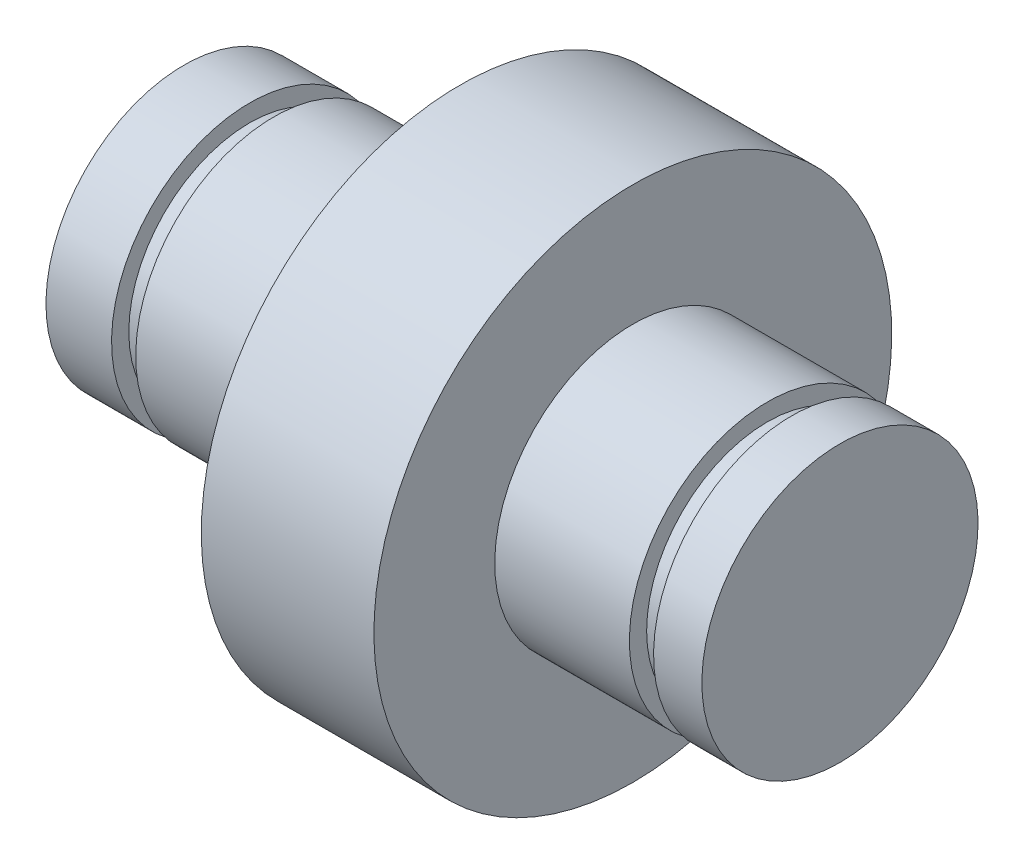
ISO-10303-21;
HEADER;
FILE_DESCRIPTION(('STEP AP214'),'2;1');
FILE_NAME('part.step','',(''),(''),'','','');
FILE_SCHEMA(('AUTOMOTIVE_DESIGN { 1 0 10303 214 1 1 1 1 }'));
ENDSEC;
DATA;
#1=APPLICATION_CONTEXT('core data for automotive mechanical design processes');
#2=APPLICATION_PROTOCOL_DEFINITION('international standard','automotive_design',2000,#1);
#3=PRODUCT_CONTEXT('',#1,'mechanical');
#4=PRODUCT('Part','Part','',(#3));
#5=PRODUCT_RELATED_PRODUCT_CATEGORY('part','',(#4));
#6=PRODUCT_DEFINITION_FORMATION('','',#4);
#7=PRODUCT_DEFINITION_CONTEXT('part definition',#1,'design');
#8=PRODUCT_DEFINITION('design','',#6,#7);
#9=PRODUCT_DEFINITION_SHAPE('','',#8);
#10=(LENGTH_UNIT() NAMED_UNIT(*) SI_UNIT(.MILLI.,.METRE.));
#11=(NAMED_UNIT(*) PLANE_ANGLE_UNIT() SI_UNIT($,.RADIAN.));
#12=(NAMED_UNIT(*) SI_UNIT($,.STERADIAN.) SOLID_ANGLE_UNIT());
#13=UNCERTAINTY_MEASURE_WITH_UNIT(LENGTH_MEASURE(1.E-05),#10,'distance_accuracy_value','');
#14=(GEOMETRIC_REPRESENTATION_CONTEXT(3) GLOBAL_UNCERTAINTY_ASSIGNED_CONTEXT((#13)) GLOBAL_UNIT_ASSIGNED_CONTEXT((#10,
#11,#12)) REPRESENTATION_CONTEXT('',''));
#15=CARTESIAN_POINT('',(0.,0.,0.));
#16=DIRECTION('',(0.,0.,1.));
#17=DIRECTION('',(1.,0.,0.));
#18=AXIS2_PLACEMENT_3D('',#15,#16,#17);
#19=CARTESIAN_POINT('',(-8.,0.,0.));
#20=DIRECTION('',(1.,0.,0.));
#21=DIRECTION('',(0.,1.,0.));
#22=AXIS2_PLACEMENT_3D('',#19,#20,#21);
#23=PLANE('',#22);
#24=CARTESIAN_POINT('',(-8.,0.,0.));
#25=DIRECTION('',(-1.,0.,0.));
#26=DIRECTION('',(0.,-1.,0.));
#27=AXIS2_PLACEMENT_3D('',#24,#25,#26);
#28=CIRCLE('',#27,4.);
#29=CARTESIAN_POINT('',(-8.,-4.,0.));
#30=VERTEX_POINT('',#29);
#31=EDGE_CURVE('E10',#30,#30,#28,.T.);
#32=ORIENTED_EDGE('',*,*,#31,.T.);
#33=EDGE_LOOP('',(#32));
#34=FACE_BOUND('',#33,.T.);
#35=ADVANCED_FACE('F37',(#34),#23,.F.);
#36=CARTESIAN_POINT('',(-10.8004648691461,0.,0.));
#37=DIRECTION('',(-1.,0.,0.));
#38=DIRECTION('',(0.,-1.,0.));
#39=AXIS2_PLACEMENT_3D('',#36,#37,#38);
#40=CYLINDRICAL_SURFACE('',#39,4.);
#41=ORIENTED_EDGE('',*,*,#31,.F.);
#42=EDGE_LOOP('',(#41));
#43=FACE_BOUND('',#42,.T.);
#44=CARTESIAN_POINT('',(-6.1,0.,0.));
#45=DIRECTION('',(-1.,0.,0.));
#46=DIRECTION('',(0.,-1.,0.));
#47=AXIS2_PLACEMENT_3D('',#44,#45,#46);
#48=CIRCLE('',#47,4.);
#49=CARTESIAN_POINT('',(-6.1,-4.,0.));
#50=VERTEX_POINT('',#49);
#51=EDGE_CURVE('E44',#50,#50,#48,.T.);
#52=ORIENTED_EDGE('',*,*,#51,.T.);
#53=EDGE_LOOP('',(#52));
#54=FACE_BOUND('',#53,.T.);
#55=ADVANCED_FACE('F113',(#43,#54),#40,.T.);
#56=CARTESIAN_POINT('',(-6.1,4.,0.));
#57=DIRECTION('',(-1.,0.,0.));
#58=DIRECTION('',(0.,-1.,0.));
#59=AXIS2_PLACEMENT_3D('',#56,#57,#58);
#60=PLANE('',#59);
#61=ORIENTED_EDGE('',*,*,#51,.F.);
#62=EDGE_LOOP('',(#61));
#63=FACE_BOUND('',#62,.T.);
#64=CARTESIAN_POINT('',(-6.1,0.,0.));
#65=DIRECTION('',(-1.,0.,0.));
#66=DIRECTION('',(0.,-1.,0.));
#67=AXIS2_PLACEMENT_3D('',#64,#65,#66);
#68=CIRCLE('',#67,3.5);
#69=CARTESIAN_POINT('',(-6.1,-3.5,0.));
#70=VERTEX_POINT('',#69);
#71=EDGE_CURVE('E49',#70,#70,#68,.T.);
#72=ORIENTED_EDGE('',*,*,#71,.T.);
#73=EDGE_LOOP('',(#72));
#74=FACE_BOUND('',#73,.T.);
#75=ADVANCED_FACE('F117',(#63,#74),#60,.F.);
#76=CARTESIAN_POINT('',(-10.8004648691461,0.,0.));
#77=DIRECTION('',(-1.,0.,0.));
#78=DIRECTION('',(0.,-1.,0.));
#79=AXIS2_PLACEMENT_3D('',#76,#77,#78);
#80=CYLINDRICAL_SURFACE('',#79,3.5);
#81=ORIENTED_EDGE('',*,*,#71,.F.);
#82=EDGE_LOOP('',(#81));
#83=FACE_BOUND('',#82,.T.);
#84=CARTESIAN_POINT('',(-5.4,0.,0.));
#85=DIRECTION('',(-1.,0.,0.));
#86=DIRECTION('',(0.,-1.,0.));
#87=AXIS2_PLACEMENT_3D('',#84,#85,#86);
#88=CIRCLE('',#87,3.5);
#89=CARTESIAN_POINT('',(-5.4,-3.5,0.));
#90=VERTEX_POINT('',#89);
#91=EDGE_CURVE('E54',#90,#90,#88,.T.);
#92=ORIENTED_EDGE('',*,*,#91,.T.);
#93=EDGE_LOOP('',(#92));
#94=FACE_BOUND('',#93,.T.);
#95=ADVANCED_FACE('F122',(#83,#94),#80,.T.);
#96=CARTESIAN_POINT('',(-5.4,3.5,0.));
#97=DIRECTION('',(1.,0.,0.));
#98=DIRECTION('',(0.,1.,0.));
#99=AXIS2_PLACEMENT_3D('',#96,#97,#98);
#100=PLANE('',#99);
#101=ORIENTED_EDGE('',*,*,#91,.F.);
#102=EDGE_LOOP('',(#101));
#103=FACE_BOUND('',#102,.T.);
#104=CARTESIAN_POINT('',(-5.4,0.,0.));
#105=DIRECTION('',(-1.,0.,0.));
#106=DIRECTION('',(0.,-1.,0.));
#107=AXIS2_PLACEMENT_3D('',#104,#105,#106);
#108=CIRCLE('',#107,4.);
#109=CARTESIAN_POINT('',(-5.4,-4.,0.));
#110=VERTEX_POINT('',#109);
#111=EDGE_CURVE('E60',#110,#110,#108,.T.);
#112=ORIENTED_EDGE('',*,*,#111,.T.);
#113=EDGE_LOOP('',(#112));
#114=FACE_BOUND('',#113,.T.);
#115=ADVANCED_FACE('F128',(#103,#114),#100,.F.);
#116=CARTESIAN_POINT('',(-10.8004648691461,0.,0.));
#117=DIRECTION('',(-1.,0.,0.));
#118=DIRECTION('',(0.,-1.,0.));
#119=AXIS2_PLACEMENT_3D('',#116,#117,#118);
#120=CYLINDRICAL_SURFACE('',#119,4.);
#121=ORIENTED_EDGE('',*,*,#111,.F.);
#122=EDGE_LOOP('',(#121));
#123=FACE_BOUND('',#122,.T.);
#124=CARTESIAN_POINT('',(0.,0.,0.));
#125=DIRECTION('',(-1.,0.,0.));
#126=DIRECTION('',(0.,-1.,0.));
#127=AXIS2_PLACEMENT_3D('',#124,#125,#126);
#128=CIRCLE('',#127,4.);
#129=CARTESIAN_POINT('',(0.,-4.,0.));
#130=VERTEX_POINT('',#129);
#131=EDGE_CURVE('E64',#130,#130,#128,.T.);
#132=ORIENTED_EDGE('',*,*,#131,.T.);
#133=EDGE_LOOP('',(#132));
#134=FACE_BOUND('',#133,.T.);
#135=ADVANCED_FACE('F132',(#123,#134),#120,.T.);
#136=CARTESIAN_POINT('',(0.,4.,0.));
#137=DIRECTION('',(1.,0.,0.));
#138=DIRECTION('',(0.,1.,0.));
#139=AXIS2_PLACEMENT_3D('',#136,#137,#138);
#140=PLANE('',#139);
#141=ORIENTED_EDGE('',*,*,#131,.F.);
#142=EDGE_LOOP('',(#141));
#143=FACE_BOUND('',#142,.T.);
#144=CARTESIAN_POINT('',(0.,0.,0.));
#145=DIRECTION('',(-1.,0.,0.));
#146=DIRECTION('',(0.,-1.,0.));
#147=AXIS2_PLACEMENT_3D('',#144,#145,#146);
#148=CIRCLE('',#147,7.5);
#149=CARTESIAN_POINT('',(0.,-7.5,0.));
#150=VERTEX_POINT('',#149);
#151=EDGE_CURVE('E68',#150,#150,#148,.T.);
#152=ORIENTED_EDGE('',*,*,#151,.T.);
#153=EDGE_LOOP('',(#152));
#154=FACE_BOUND('',#153,.T.);
#155=ADVANCED_FACE('F136',(#143,#154),#140,.F.);
#156=CARTESIAN_POINT('',(-10.8004648691461,0.,0.));
#157=DIRECTION('',(-1.,0.,0.));
#158=DIRECTION('',(0.,-1.,0.));
#159=AXIS2_PLACEMENT_3D('',#156,#157,#158);
#160=CYLINDRICAL_SURFACE('',#159,7.5);
#161=ORIENTED_EDGE('',*,*,#151,.F.);
#162=EDGE_LOOP('',(#161));
#163=FACE_BOUND('',#162,.T.);
#164=CARTESIAN_POINT('',(5.,0.,0.));
#165=DIRECTION('',(-1.,0.,0.));
#166=DIRECTION('',(0.,-1.,0.));
#167=AXIS2_PLACEMENT_3D('',#164,#165,#166);
#168=CIRCLE('',#167,7.5);
#169=CARTESIAN_POINT('',(5.,-7.5,0.));
#170=VERTEX_POINT('',#169);
#171=EDGE_CURVE('E72',#170,#170,#168,.T.);
#172=ORIENTED_EDGE('',*,*,#171,.T.);
#173=EDGE_LOOP('',(#172));
#174=FACE_BOUND('',#173,.T.);
#175=ADVANCED_FACE('F140',(#163,#174),#160,.T.);
#176=CARTESIAN_POINT('',(5.,7.5,0.));
#177=DIRECTION('',(-1.,0.,0.));
#178=DIRECTION('',(0.,-1.,0.));
#179=AXIS2_PLACEMENT_3D('',#176,#177,#178);
#180=PLANE('',#179);
#181=ORIENTED_EDGE('',*,*,#171,.F.);
#182=EDGE_LOOP('',(#181));
#183=FACE_BOUND('',#182,.T.);
#184=CARTESIAN_POINT('',(5.,0.,0.));
#185=DIRECTION('',(-1.,0.,0.));
#186=DIRECTION('',(0.,-1.,0.));
#187=AXIS2_PLACEMENT_3D('',#184,#185,#186);
#188=CIRCLE('',#187,4.);
#189=CARTESIAN_POINT('',(5.,-4.,0.));
#190=VERTEX_POINT('',#189);
#191=EDGE_CURVE('E76',#190,#190,#188,.T.);
#192=ORIENTED_EDGE('',*,*,#191,.T.);
#193=EDGE_LOOP('',(#192));
#194=FACE_BOUND('',#193,.T.);
#195=ADVANCED_FACE('F144',(#183,#194),#180,.F.);
#196=CARTESIAN_POINT('',(-10.8004648691461,0.,0.));
#197=DIRECTION('',(-1.,0.,0.));
#198=DIRECTION('',(0.,-1.,0.));
#199=AXIS2_PLACEMENT_3D('',#196,#197,#198);
#200=CYLINDRICAL_SURFACE('',#199,4.);
#201=ORIENTED_EDGE('',*,*,#191,.F.);
#202=EDGE_LOOP('',(#201));
#203=FACE_BOUND('',#202,.T.);
#204=CARTESIAN_POINT('',(8.9,0.,0.));
#205=DIRECTION('',(-1.,0.,0.));
#206=DIRECTION('',(0.,-1.,0.));
#207=AXIS2_PLACEMENT_3D('',#204,#205,#206);
#208=CIRCLE('',#207,4.);
#209=CARTESIAN_POINT('',(8.9,-4.,0.));
#210=VERTEX_POINT('',#209);
#211=EDGE_CURVE('E80',#210,#210,#208,.T.);
#212=ORIENTED_EDGE('',*,*,#211,.T.);
#213=EDGE_LOOP('',(#212));
#214=FACE_BOUND('',#213,.T.);
#215=ADVANCED_FACE('F148',(#203,#214),#200,.T.);
#216=CARTESIAN_POINT('',(8.9,4.,0.));
#217=DIRECTION('',(-1.,0.,0.));
#218=DIRECTION('',(0.,-1.,0.));
#219=AXIS2_PLACEMENT_3D('',#216,#217,#218);
#220=PLANE('',#219);
#221=ORIENTED_EDGE('',*,*,#211,.F.);
#222=EDGE_LOOP('',(#221));
#223=FACE_BOUND('',#222,.T.);
#224=CARTESIAN_POINT('',(8.9,0.,0.));
#225=DIRECTION('',(-1.,0.,0.));
#226=DIRECTION('',(0.,-1.,0.));
#227=AXIS2_PLACEMENT_3D('',#224,#225,#226);
#228=CIRCLE('',#227,3.5);
#229=CARTESIAN_POINT('',(8.9,-3.5,0.));
#230=VERTEX_POINT('',#229);
#231=EDGE_CURVE('E84',#230,#230,#228,.T.);
#232=ORIENTED_EDGE('',*,*,#231,.T.);
#233=EDGE_LOOP('',(#232));
#234=FACE_BOUND('',#233,.T.);
#235=ADVANCED_FACE('F152',(#223,#234),#220,.F.);
#236=CARTESIAN_POINT('',(-10.8004648691461,0.,0.));
#237=DIRECTION('',(-1.,0.,0.));
#238=DIRECTION('',(0.,-1.,0.));
#239=AXIS2_PLACEMENT_3D('',#236,#237,#238);
#240=CYLINDRICAL_SURFACE('',#239,3.5);
#241=ORIENTED_EDGE('',*,*,#231,.F.);
#242=EDGE_LOOP('',(#241));
#243=FACE_BOUND('',#242,.T.);
#244=CARTESIAN_POINT('',(9.6,0.,0.));
#245=DIRECTION('',(-1.,0.,0.));
#246=DIRECTION('',(0.,-1.,0.));
#247=AXIS2_PLACEMENT_3D('',#244,#245,#246);
#248=CIRCLE('',#247,3.5);
#249=CARTESIAN_POINT('',(9.6,-3.5,0.));
#250=VERTEX_POINT('',#249);
#251=EDGE_CURVE('E88',#250,#250,#248,.T.);
#252=ORIENTED_EDGE('',*,*,#251,.T.);
#253=EDGE_LOOP('',(#252));
#254=FACE_BOUND('',#253,.T.);
#255=ADVANCED_FACE('F156',(#243,#254),#240,.T.);
#256=CARTESIAN_POINT('',(9.6,3.5,0.));
#257=DIRECTION('',(1.,0.,0.));
#258=DIRECTION('',(0.,1.,0.));
#259=AXIS2_PLACEMENT_3D('',#256,#257,#258);
#260=PLANE('',#259);
#261=ORIENTED_EDGE('',*,*,#251,.F.);
#262=EDGE_LOOP('',(#261));
#263=FACE_BOUND('',#262,.T.);
#264=CARTESIAN_POINT('',(9.6,0.,0.));
#265=DIRECTION('',(-1.,0.,0.));
#266=DIRECTION('',(0.,-1.,0.));
#267=AXIS2_PLACEMENT_3D('',#264,#265,#266);
#268=CIRCLE('',#267,4.);
#269=CARTESIAN_POINT('',(9.6,-4.,0.));
#270=VERTEX_POINT('',#269);
#271=EDGE_CURVE('E92',#270,#270,#268,.T.);
#272=ORIENTED_EDGE('',*,*,#271,.T.);
#273=EDGE_LOOP('',(#272));
#274=FACE_BOUND('',#273,.T.);
#275=ADVANCED_FACE('F109',(#263,#274),#260,.F.);
#276=CARTESIAN_POINT('',(-10.8004648691461,0.,0.));
#277=DIRECTION('',(-1.,0.,0.));
#278=DIRECTION('',(0.,-1.,0.));
#279=AXIS2_PLACEMENT_3D('',#276,#277,#278);
#280=CYLINDRICAL_SURFACE('',#279,4.);
#281=ORIENTED_EDGE('',*,*,#271,.F.);
#282=EDGE_LOOP('',(#281));
#283=FACE_BOUND('',#282,.T.);
#284=CARTESIAN_POINT('',(11.,0.,0.));
#285=DIRECTION('',(-1.,0.,0.));
#286=DIRECTION('',(0.,-1.,0.));
#287=AXIS2_PLACEMENT_3D('',#284,#285,#286);
#288=CIRCLE('',#287,4.);
#289=CARTESIAN_POINT('',(11.,-4.,0.));
#290=VERTEX_POINT('',#289);
#291=EDGE_CURVE('E96',#290,#290,#288,.T.);
#292=ORIENTED_EDGE('',*,*,#291,.T.);
#293=EDGE_LOOP('',(#292));
#294=FACE_BOUND('',#293,.T.);
#295=ADVANCED_FACE('F101',(#283,#294),#280,.T.);
#296=CARTESIAN_POINT('',(11.,4.,0.));
#297=DIRECTION('',(-1.,0.,0.));
#298=DIRECTION('',(0.,-1.,0.));
#299=AXIS2_PLACEMENT_3D('',#296,#297,#298);
#300=PLANE('',#299);
#301=ORIENTED_EDGE('',*,*,#291,.F.);
#302=EDGE_LOOP('',(#301));
#303=FACE_BOUND('',#302,.T.);
#304=ADVANCED_FACE('F103',(#303),#300,.F.);
#305=CLOSED_SHELL('',(#35,#55,#75,#95,#115,#135,#155,#175,#195,#215,#235,#255,#275,#295,#304));
#306=MANIFOLD_SOLID_BREP('B2',#305);
#307=ADVANCED_BREP_SHAPE_REPRESENTATION('',(#18,#306),#14);
#308=SHAPE_DEFINITION_REPRESENTATION(#9,#307);
ENDSEC;
END-ISO-10303-21;
